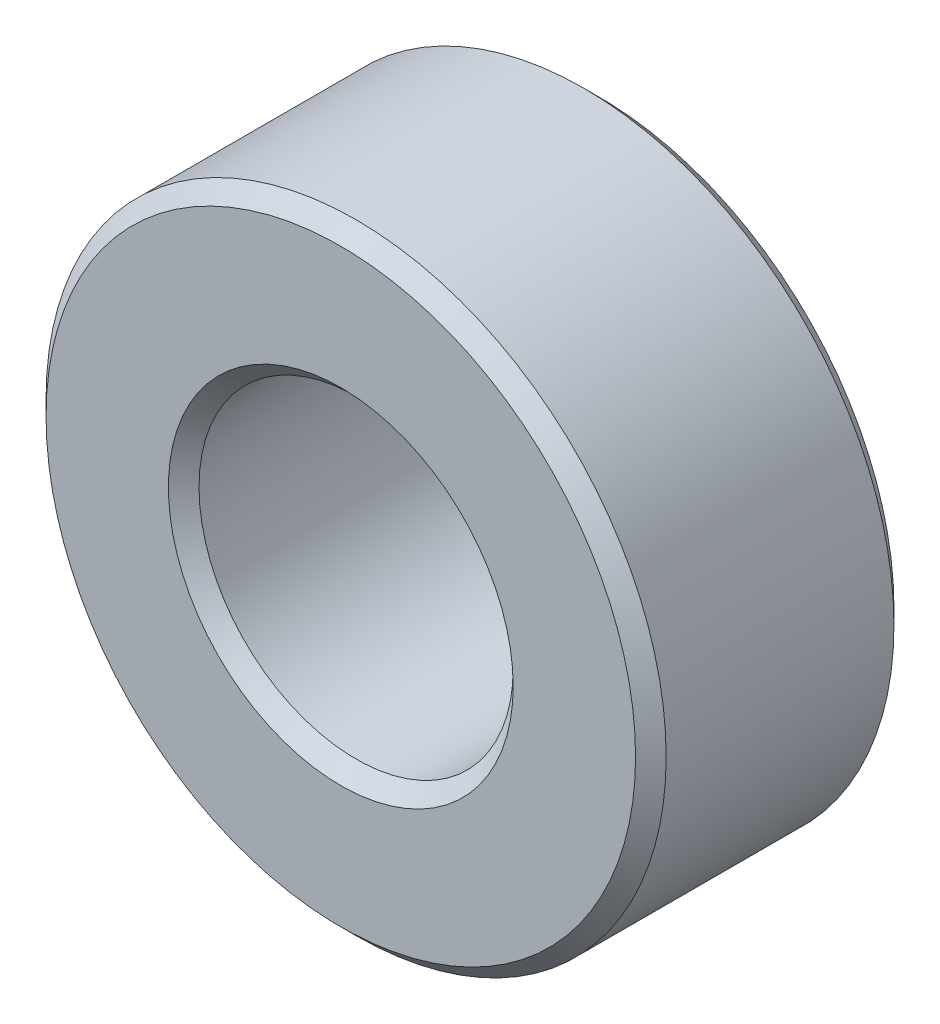
ISO-10303-21;
HEADER;
FILE_DESCRIPTION(('STEP AP214'),'2;1');
FILE_NAME('part.step','',(''),(''),'','','');
FILE_SCHEMA(('AUTOMOTIVE_DESIGN { 1 0 10303 214 1 1 1 1 }'));
ENDSEC;
DATA;
#1=APPLICATION_CONTEXT('core data for automotive mechanical design processes');
#2=APPLICATION_PROTOCOL_DEFINITION('international standard','automotive_design',2000,#1);
#3=PRODUCT_CONTEXT('',#1,'mechanical');
#4=PRODUCT('Part','Part','',(#3));
#5=PRODUCT_RELATED_PRODUCT_CATEGORY('part','',(#4));
#6=PRODUCT_DEFINITION_FORMATION('','',#4);
#7=PRODUCT_DEFINITION_CONTEXT('part definition',#1,'design');
#8=PRODUCT_DEFINITION('design','',#6,#7);
#9=PRODUCT_DEFINITION_SHAPE('','',#8);
#10=(LENGTH_UNIT() NAMED_UNIT(*) SI_UNIT(.MILLI.,.METRE.));
#11=(NAMED_UNIT(*) PLANE_ANGLE_UNIT() SI_UNIT($,.RADIAN.));
#12=(NAMED_UNIT(*) SI_UNIT($,.STERADIAN.) SOLID_ANGLE_UNIT());
#13=UNCERTAINTY_MEASURE_WITH_UNIT(LENGTH_MEASURE(1.E-05),#10,'distance_accuracy_value','');
#14=(GEOMETRIC_REPRESENTATION_CONTEXT(3) GLOBAL_UNCERTAINTY_ASSIGNED_CONTEXT((#13)) GLOBAL_UNIT_ASSIGNED_CONTEXT((#10,
#11,#12)) REPRESENTATION_CONTEXT('',''));
#15=CARTESIAN_POINT('',(0.,0.,0.));
#16=DIRECTION('',(0.,0.,1.));
#17=DIRECTION('',(1.,0.,0.));
#18=AXIS2_PLACEMENT_3D('',#15,#16,#17);
#19=CARTESIAN_POINT('',(0.,0.,-3.96875));
#20=DIRECTION('',(0.,0.,1.));
#21=DIRECTION('',(1.,0.,0.));
#22=AXIS2_PLACEMENT_3D('',#19,#20,#21);
#23=CYLINDRICAL_SURFACE('',#22,9.525);
#24=CARTESIAN_POINT('',(0.,0.,3.49885));
#25=DIRECTION('',(0.,0.,1.));
#26=DIRECTION('',(1.,0.,0.));
#27=AXIS2_PLACEMENT_3D('',#24,#25,#26);
#28=CIRCLE('',#27,9.525);
#29=CARTESIAN_POINT('',(9.525,0.,3.49885));
#30=VERTEX_POINT('',#29);
#31=EDGE_CURVE('E52',#30,#30,#28,.F.);
#32=ORIENTED_EDGE('',*,*,#31,.T.);
#33=EDGE_LOOP('',(#32));
#34=FACE_BOUND('',#33,.T.);
#35=CARTESIAN_POINT('',(0.,0.,-3.49885));
#36=DIRECTION('',(0.,0.,1.));
#37=DIRECTION('',(1.,0.,0.));
#38=AXIS2_PLACEMENT_3D('',#35,#36,#37);
#39=CIRCLE('',#38,9.525);
#40=CARTESIAN_POINT('',(9.525,0.,-3.49885));
#41=VERTEX_POINT('',#40);
#42=EDGE_CURVE('E55',#41,#41,#39,.T.);
#43=ORIENTED_EDGE('',*,*,#42,.T.);
#44=EDGE_LOOP('',(#43));
#45=FACE_BOUND('',#44,.T.);
#46=ADVANCED_FACE('F32',(#34,#45),#23,.T.);
#47=CARTESIAN_POINT('',(0.,0.,-3.96875));
#48=DIRECTION('',(0.,0.,1.));
#49=DIRECTION('',(1.,0.,0.));
#50=AXIS2_PLACEMENT_3D('',#47,#48,#49);
#51=PLANE('',#50);
#52=CARTESIAN_POINT('',(0.,0.,-3.96875));
#53=DIRECTION('',(0.,0.,1.));
#54=DIRECTION('',(1.,0.,0.));
#55=AXIS2_PLACEMENT_3D('',#52,#53,#54);
#56=CIRCLE('',#55,9.0551);
#57=CARTESIAN_POINT('',(9.0551,0.,-3.96875));
#58=VERTEX_POINT('',#57);
#59=EDGE_CURVE('E43',#58,#58,#56,.F.);
#60=ORIENTED_EDGE('',*,*,#59,.T.);
#61=EDGE_LOOP('',(#60));
#62=FACE_BOUND('',#61,.T.);
#63=CARTESIAN_POINT('',(0.,0.,-3.96875));
#64=DIRECTION('',(0.,0.,1.));
#65=DIRECTION('',(1.,0.,0.));
#66=AXIS2_PLACEMENT_3D('',#63,#64,#65);
#67=CIRCLE('',#66,5.2959);
#68=CARTESIAN_POINT('',(5.2959,0.,-3.96875));
#69=VERTEX_POINT('',#68);
#70=EDGE_CURVE('E47',#69,#69,#67,.T.);
#71=ORIENTED_EDGE('',*,*,#70,.T.);
#72=EDGE_LOOP('',(#71));
#73=FACE_BOUND('',#72,.T.);
#74=ADVANCED_FACE('F80',(#62,#73),#51,.F.);
#75=CARTESIAN_POINT('',(0.,0.,-3.96875));
#76=DIRECTION('',(0.,0.,1.));
#77=DIRECTION('',(1.,0.,0.));
#78=AXIS2_PLACEMENT_3D('',#75,#76,#77);
#79=CYLINDRICAL_SURFACE('',#78,4.826);
#80=CARTESIAN_POINT('',(0.,0.,3.49885));
#81=DIRECTION('',(0.,0.,1.));
#82=DIRECTION('',(1.,0.,0.));
#83=AXIS2_PLACEMENT_3D('',#80,#81,#82);
#84=CIRCLE('',#83,4.826);
#85=CARTESIAN_POINT('',(4.826,0.,3.49885));
#86=VERTEX_POINT('',#85);
#87=EDGE_CURVE('E10',#86,#86,#84,.T.);
#88=CARTESIAN_POINT('',(0.,0.,-3.49885));
#89=DIRECTION('',(0.,0.,1.));
#90=DIRECTION('',(1.,0.,0.));
#91=AXIS2_PLACEMENT_3D('',#88,#89,#90);
#92=CIRCLE('',#91,4.826);
#93=CARTESIAN_POINT('',(4.826,0.,-3.49885));
#94=VERTEX_POINT('',#93);
#95=EDGE_CURVE('E39',#94,#94,#92,.F.);
#96=CARTESIAN_POINT('',(4.826,0.,3.49885));
#97=CARTESIAN_POINT('',(4.826,0.,3.42595729166667));
#98=CARTESIAN_POINT('',(4.826,0.,3.35306458333333));
#99=CARTESIAN_POINT('',(4.826,0.,3.20727916666667));
#100=CARTESIAN_POINT('',(4.826,0.,3.13438645833333));
#101=CARTESIAN_POINT('',(4.826,0.,2.98860104166667));
#102=CARTESIAN_POINT('',(4.826,0.,2.91570833333333));
#103=CARTESIAN_POINT('',(4.826,0.,2.76992291666667));
#104=CARTESIAN_POINT('',(4.826,0.,2.69703020833333));
#105=CARTESIAN_POINT('',(4.826,0.,2.55124479166667));
#106=CARTESIAN_POINT('',(4.826,0.,2.47835208333333));
#107=CARTESIAN_POINT('',(4.826,0.,2.33256666666667));
#108=CARTESIAN_POINT('',(4.826,0.,2.25967395833333));
#109=CARTESIAN_POINT('',(4.826,0.,2.11388854166667));
#110=CARTESIAN_POINT('',(4.826,0.,2.04099583333333));
#111=CARTESIAN_POINT('',(4.826,0.,1.89521041666667));
#112=CARTESIAN_POINT('',(4.826,0.,1.82231770833333));
#113=CARTESIAN_POINT('',(4.826,0.,1.67653229166667));
#114=CARTESIAN_POINT('',(4.826,0.,1.60363958333333));
#115=CARTESIAN_POINT('',(4.826,0.,1.45785416666667));
#116=CARTESIAN_POINT('',(4.826,0.,1.38496145833333));
#117=CARTESIAN_POINT('',(4.826,0.,1.23917604166667));
#118=CARTESIAN_POINT('',(4.826,0.,1.16628333333333));
#119=CARTESIAN_POINT('',(4.826,0.,1.02049791666667));
#120=CARTESIAN_POINT('',(4.826,0.,0.947605208333334));
#121=CARTESIAN_POINT('',(4.826,0.,0.801819791666668));
#122=CARTESIAN_POINT('',(4.826,0.,0.728927083333335));
#123=CARTESIAN_POINT('',(4.826,0.,0.583141666666668));
#124=CARTESIAN_POINT('',(4.826,0.,0.510248958333335));
#125=CARTESIAN_POINT('',(4.826,0.,0.364463541666668));
#126=CARTESIAN_POINT('',(4.826,0.,0.291570833333334));
#127=CARTESIAN_POINT('',(4.826,0.,0.145785416666667));
#128=CARTESIAN_POINT('',(4.826,0.,0.0728927083333342));
#129=CARTESIAN_POINT('',(4.826,0.,-0.0728927083333324));
#130=CARTESIAN_POINT('',(4.826,0.,-0.145785416666666));
#131=CARTESIAN_POINT('',(4.826,0.,-0.291570833333332));
#132=CARTESIAN_POINT('',(4.826,0.,-0.364463541666666));
#133=CARTESIAN_POINT('',(4.826,0.,-0.510248958333332));
#134=CARTESIAN_POINT('',(4.826,0.,-0.583141666666666));
#135=CARTESIAN_POINT('',(4.826,0.,-0.728927083333333));
#136=CARTESIAN_POINT('',(4.826,0.,-0.801819791666666));
#137=CARTESIAN_POINT('',(4.826,0.,-0.947605208333333));
#138=CARTESIAN_POINT('',(4.826,0.,-1.02049791666667));
#139=CARTESIAN_POINT('',(4.826,0.,-1.16628333333333));
#140=CARTESIAN_POINT('',(4.826,0.,-1.23917604166667));
#141=CARTESIAN_POINT('',(4.826,0.,-1.38496145833333));
#142=CARTESIAN_POINT('',(4.826,0.,-1.45785416666667));
#143=CARTESIAN_POINT('',(4.826,0.,-1.60363958333333));
#144=CARTESIAN_POINT('',(4.826,0.,-1.67653229166667));
#145=CARTESIAN_POINT('',(4.826,0.,-1.82231770833333));
#146=CARTESIAN_POINT('',(4.826,0.,-1.89521041666667));
#147=CARTESIAN_POINT('',(4.826,0.,-2.04099583333333));
#148=CARTESIAN_POINT('',(4.826,0.,-2.11388854166667));
#149=CARTESIAN_POINT('',(4.826,0.,-2.25967395833333));
#150=CARTESIAN_POINT('',(4.826,0.,-2.33256666666667));
#151=CARTESIAN_POINT('',(4.826,0.,-2.47835208333333));
#152=CARTESIAN_POINT('',(4.826,0.,-2.55124479166667));
#153=CARTESIAN_POINT('',(4.826,0.,-2.69703020833333));
#154=CARTESIAN_POINT('',(4.826,0.,-2.76992291666667));
#155=CARTESIAN_POINT('',(4.826,0.,-2.91570833333333));
#156=CARTESIAN_POINT('',(4.826,0.,-2.98860104166667));
#157=CARTESIAN_POINT('',(4.826,0.,-3.13438645833333));
#158=CARTESIAN_POINT('',(4.826,0.,-3.20727916666667));
#159=CARTESIAN_POINT('',(4.826,0.,-3.35306458333333));
#160=CARTESIAN_POINT('',(4.826,0.,-3.42595729166667));
#161=CARTESIAN_POINT('',(4.826,0.,-3.49885));
#162=B_SPLINE_CURVE_WITH_KNOTS('',3,(#96,#97,#98,#99,#100,#101,#102,#103,#104,#105,#106,#107,
#108,#109,#110,#111,#112,#113,#114,#115,#116,#117,#118,#119,#120,#121,#122,#123,#124,#125,#126,
#127,#128,#129,#130,#131,#132,#133,#134,#135,#136,#137,#138,#139,#140,#141,#142,#143,#144,#145,
#146,#147,#148,#149,#150,#151,#152,#153,#154,#155,#156,#157,#158,#159,#160,#161),.UNSPECIFIED.,
.F.,.F.,(4,2,2,2,2,2,2,2,2,2,2,2,2,2,2,2,2,2,2,2,2,2,2,2,2,2,2,2,2,2,2,2,4),(0.,0.218678125,
0.43735625,0.656034375,0.8747125,1.093390625,1.31206875,1.530746875,1.749425,1.968103125,
2.18678125,2.405459375,2.6241375,2.842815625,3.06149375,3.280171875,3.49885,3.717528125,
3.93620625,4.154884375,4.3735625,4.592240625,4.81091875,5.029596875,5.248275,5.466953125,
5.68563125,5.904309375,6.1229875,6.341665625,6.56034375,6.779021875,6.9977),.UNSPECIFIED.);
#163=EDGE_CURVE('BSEAM86',#86,#94,#162,.T.);
#164=ORIENTED_EDGE('',*,*,#87,.T.);
#165=ORIENTED_EDGE('',*,*,#95,.T.);
#166=ORIENTED_EDGE('',*,*,#163,.T.);
#167=ORIENTED_EDGE('',*,*,#163,.F.);
#168=EDGE_LOOP('',(#164,#166,#165,#167));
#169=FACE_BOUND('',#168,.T.);
#170=ADVANCED_FACE('F86',(#169),#79,.F.);
#171=CARTESIAN_POINT('',(0.,0.,3.96875));
#172=DIRECTION('',(0.,0.,1.));
#173=DIRECTION('',(1.,0.,0.));
#174=AXIS2_PLACEMENT_3D('',#171,#172,#173);
#175=PLANE('',#174);
#176=CARTESIAN_POINT('',(0.,0.,3.96875));
#177=DIRECTION('',(0.,0.,1.));
#178=DIRECTION('',(1.,0.,0.));
#179=AXIS2_PLACEMENT_3D('',#176,#177,#178);
#180=CIRCLE('',#179,9.0551);
#181=CARTESIAN_POINT('',(9.0551,0.,3.96875));
#182=VERTEX_POINT('',#181);
#183=EDGE_CURVE('E58',#182,#182,#180,.T.);
#184=ORIENTED_EDGE('',*,*,#183,.T.);
#185=EDGE_LOOP('',(#184));
#186=FACE_BOUND('',#185,.T.);
#187=CARTESIAN_POINT('',(0.,0.,3.96875));
#188=DIRECTION('',(0.,0.,1.));
#189=DIRECTION('',(1.,0.,0.));
#190=AXIS2_PLACEMENT_3D('',#187,#188,#189);
#191=CIRCLE('',#190,5.2959);
#192=CARTESIAN_POINT('',(5.2959,0.,3.96875));
#193=VERTEX_POINT('',#192);
#194=EDGE_CURVE('E61',#193,#193,#191,.F.);
#195=ORIENTED_EDGE('',*,*,#194,.T.);
#196=EDGE_LOOP('',(#195));
#197=FACE_BOUND('',#196,.T.);
#198=ADVANCED_FACE('F65',(#186,#197),#175,.T.);
#199=CARTESIAN_POINT('',(0.,0.,3.96875));
#200=DIRECTION('',(0.,0.,-1.));
#201=DIRECTION('',(-1.,0.,0.));
#202=AXIS2_PLACEMENT_3D('',#199,#200,#201);
#203=CONICAL_SURFACE('',#202,9.0551,0.785398163397446);
#204=ORIENTED_EDGE('',*,*,#31,.F.);
#205=EDGE_LOOP('',(#204));
#206=FACE_BOUND('',#205,.T.);
#207=ORIENTED_EDGE('',*,*,#183,.F.);
#208=EDGE_LOOP('',(#207));
#209=FACE_BOUND('',#208,.T.);
#210=ADVANCED_FACE('F76',(#206,#209),#203,.T.);
#211=CARTESIAN_POINT('',(0.,0.,-3.49885));
#212=DIRECTION('',(0.,0.,1.));
#213=DIRECTION('',(1.,0.,0.));
#214=AXIS2_PLACEMENT_3D('',#211,#212,#213);
#215=CONICAL_SURFACE('',#214,9.525,0.785398163397452);
#216=ORIENTED_EDGE('',*,*,#59,.F.);
#217=EDGE_LOOP('',(#216));
#218=FACE_BOUND('',#217,.T.);
#219=ORIENTED_EDGE('',*,*,#42,.F.);
#220=EDGE_LOOP('',(#219));
#221=FACE_BOUND('',#220,.T.);
#222=ADVANCED_FACE('F70',(#218,#221),#215,.T.);
#223=CARTESIAN_POINT('',(0.,0.,3.49885));
#224=DIRECTION('',(0.,0.,1.));
#225=DIRECTION('',(1.,0.,0.));
#226=AXIS2_PLACEMENT_3D('',#223,#224,#225);
#227=CONICAL_SURFACE('',#226,4.826,0.785398163397454);
#228=CARTESIAN_POINT('',(5.2959,0.,3.96875));
#229=CARTESIAN_POINT('',(5.29100520833334,0.,3.96385520833333));
#230=CARTESIAN_POINT('',(5.28611041666667,0.,3.95896041666667));
#231=CARTESIAN_POINT('',(5.27632083333334,0.,3.94917083333333));
#232=CARTESIAN_POINT('',(5.27142604166667,0.,3.94427604166667));
#233=CARTESIAN_POINT('',(5.26163645833334,0.,3.93448645833333));
#234=CARTESIAN_POINT('',(5.25674166666667,0.,3.92959166666667));
#235=CARTESIAN_POINT('',(5.24695208333334,0.,3.91980208333333));
#236=CARTESIAN_POINT('',(5.24205729166667,0.,3.91490729166667));
#237=CARTESIAN_POINT('',(5.23226770833334,0.,3.90511770833333));
#238=CARTESIAN_POINT('',(5.22737291666667,0.,3.90022291666667));
#239=CARTESIAN_POINT('',(5.21758333333334,0.,3.89043333333333));
#240=CARTESIAN_POINT('',(5.21268854166667,0.,3.88553854166667));
#241=CARTESIAN_POINT('',(5.20289895833333,0.,3.87574895833333));
#242=CARTESIAN_POINT('',(5.19800416666667,0.,3.87085416666667));
#243=CARTESIAN_POINT('',(5.18821458333333,0.,3.86106458333333));
#244=CARTESIAN_POINT('',(5.18331979166667,0.,3.85616979166667));
#245=CARTESIAN_POINT('',(5.17353020833333,0.,3.84638020833333));
#246=CARTESIAN_POINT('',(5.16863541666667,0.,3.84148541666667));
#247=CARTESIAN_POINT('',(5.15884583333334,0.,3.83169583333333));
#248=CARTESIAN_POINT('',(5.15395104166667,0.,3.82680104166667));
#249=CARTESIAN_POINT('',(5.14416145833333,0.,3.81701145833333));
#250=CARTESIAN_POINT('',(5.13926666666667,0.,3.81211666666667));
#251=CARTESIAN_POINT('',(5.12947708333333,0.,3.80232708333333));
#252=CARTESIAN_POINT('',(5.12458229166667,0.,3.79743229166667));
#253=CARTESIAN_POINT('',(5.11479270833333,0.,3.78764270833333));
#254=CARTESIAN_POINT('',(5.10989791666667,0.,3.78274791666667));
#255=CARTESIAN_POINT('',(5.10010833333333,0.,3.77295833333333));
#256=CARTESIAN_POINT('',(5.09521354166667,0.,3.76806354166667));
#257=CARTESIAN_POINT('',(5.08542395833333,0.,3.75827395833333));
#258=CARTESIAN_POINT('',(5.08052916666667,0.,3.75337916666667));
#259=CARTESIAN_POINT('',(5.07073958333333,0.,3.74358958333333));
#260=CARTESIAN_POINT('',(5.06584479166667,0.,3.73869479166667));
#261=CARTESIAN_POINT('',(5.05605520833333,0.,3.72890520833333));
#262=CARTESIAN_POINT('',(5.05116041666667,0.,3.72401041666667));
#263=CARTESIAN_POINT('',(5.04137083333333,0.,3.71422083333333));
#264=CARTESIAN_POINT('',(5.03647604166667,0.,3.70932604166667));
#265=CARTESIAN_POINT('',(5.02668645833333,0.,3.69953645833333));
#266=CARTESIAN_POINT('',(5.02179166666667,0.,3.69464166666667));
#267=CARTESIAN_POINT('',(5.01200208333333,0.,3.68485208333333));
#268=CARTESIAN_POINT('',(5.00710729166667,0.,3.67995729166667));
#269=CARTESIAN_POINT('',(4.99731770833333,0.,3.67016770833333));
#270=CARTESIAN_POINT('',(4.99242291666667,0.,3.66527291666667));
#271=CARTESIAN_POINT('',(4.98263333333333,0.,3.65548333333333));
#272=CARTESIAN_POINT('',(4.97773854166667,0.,3.65058854166667));
#273=CARTESIAN_POINT('',(4.96794895833333,0.,3.64079895833333));
#274=CARTESIAN_POINT('',(4.96305416666667,0.,3.63590416666667));
#275=CARTESIAN_POINT('',(4.95326458333333,0.,3.62611458333333));
#276=CARTESIAN_POINT('',(4.94836979166667,0.,3.62121979166667));
#277=CARTESIAN_POINT('',(4.93858020833333,0.,3.61143020833333));
#278=CARTESIAN_POINT('',(4.93368541666667,0.,3.60653541666667));
#279=CARTESIAN_POINT('',(4.92389583333333,0.,3.59674583333333));
#280=CARTESIAN_POINT('',(4.91900104166667,0.,3.59185104166667));
#281=CARTESIAN_POINT('',(4.90921145833333,0.,3.58206145833333));
#282=CARTESIAN_POINT('',(4.90431666666667,0.,3.57716666666667));
#283=CARTESIAN_POINT('',(4.89452708333333,0.,3.56737708333333));
#284=CARTESIAN_POINT('',(4.88963229166667,0.,3.56248229166667));
#285=CARTESIAN_POINT('',(4.87984270833333,0.,3.55269270833333));
#286=CARTESIAN_POINT('',(4.87494791666667,0.,3.54779791666667));
#287=CARTESIAN_POINT('',(4.86515833333333,0.,3.53800833333333));
#288=CARTESIAN_POINT('',(4.86026354166667,0.,3.53311354166667));
#289=CARTESIAN_POINT('',(4.85047395833333,0.,3.52332395833334));
#290=CARTESIAN_POINT('',(4.84557916666667,0.,3.51842916666667));
#291=CARTESIAN_POINT('',(4.83578958333333,0.,3.50863958333334));
#292=CARTESIAN_POINT('',(4.83089479166667,0.,3.50374479166667));
#293=CARTESIAN_POINT('',(4.826,0.,3.49885));
#294=B_SPLINE_CURVE_WITH_KNOTS('',3,(#228,#229,#230,#231,#232,#233,#234,#235,#236,#237,#238,
#239,#240,#241,#242,#243,#244,#245,#246,#247,#248,#249,#250,#251,#252,#253,#254,#255,#256,#257,
#258,#259,#260,#261,#262,#263,#264,#265,#266,#267,#268,#269,#270,#271,#272,#273,#274,#275,#276,
#277,#278,#279,#280,#281,#282,#283,#284,#285,#286,#287,#288,#289,#290,#291,#292,#293),
.UNSPECIFIED.,.F.,.F.,(4,2,2,2,2,2,2,2,2,2,2,2,2,2,2,2,2,2,2,2,2,2,2,2,2,2,2,2,2,2,2,2,4),(0.,
0.0207668422799722,0.0415336845599444,0.0623005268399166,0.0830673691198894,0.103834211399862,
0.124601053679834,0.145367895959807,0.166134738239779,0.186901580519751,0.207668422799724,
0.228435265079696,0.249202107359669,0.269968949639641,0.290735791919613,0.311502634199586,
0.332269476479558,0.353036318759531,0.373803161039503,0.394570003319476,0.415336845599448,
0.43610368787942,0.456870530159393,0.477637372439365,0.498404214719338,0.51917105699931,
0.539937899279283,0.560704741559255,0.581471583839227,0.6022384261192,0.623005268399172,
0.643772110679145,0.664538952959117),.UNSPECIFIED.);
#295=EDGE_CURVE('BSEAM67',#193,#86,#294,.T.);
#296=ORIENTED_EDGE('',*,*,#194,.F.);
#297=ORIENTED_EDGE('',*,*,#87,.F.);
#298=ORIENTED_EDGE('',*,*,#295,.T.);
#299=ORIENTED_EDGE('',*,*,#295,.F.);
#300=EDGE_LOOP('',(#296,#298,#297,#299));
#301=FACE_BOUND('',#300,.T.);
#302=ADVANCED_FACE('F67',(#301),#227,.F.);
#303=CARTESIAN_POINT('',(0.,0.,-3.96875));
#304=DIRECTION('',(0.,0.,-1.));
#305=DIRECTION('',(-1.,0.,0.));
#306=AXIS2_PLACEMENT_3D('',#303,#304,#305);
#307=CONICAL_SURFACE('',#306,5.2959,0.785398163397447);
#308=ORIENTED_EDGE('',*,*,#95,.F.);
#309=EDGE_LOOP('',(#308));
#310=FACE_BOUND('',#309,.T.);
#311=ORIENTED_EDGE('',*,*,#70,.F.);
#312=EDGE_LOOP('',(#311));
#313=FACE_BOUND('',#312,.T.);
#314=ADVANCED_FACE('F34',(#310,#313),#307,.F.);
#315=CLOSED_SHELL('',(#46,#74,#170,#198,#210,#222,#302,#314));
#316=MANIFOLD_SOLID_BREP('B2',#315);
#317=ADVANCED_BREP_SHAPE_REPRESENTATION('',(#18,#316),#14);
#318=SHAPE_DEFINITION_REPRESENTATION(#9,#317);
ENDSEC;
END-ISO-10303-21;
